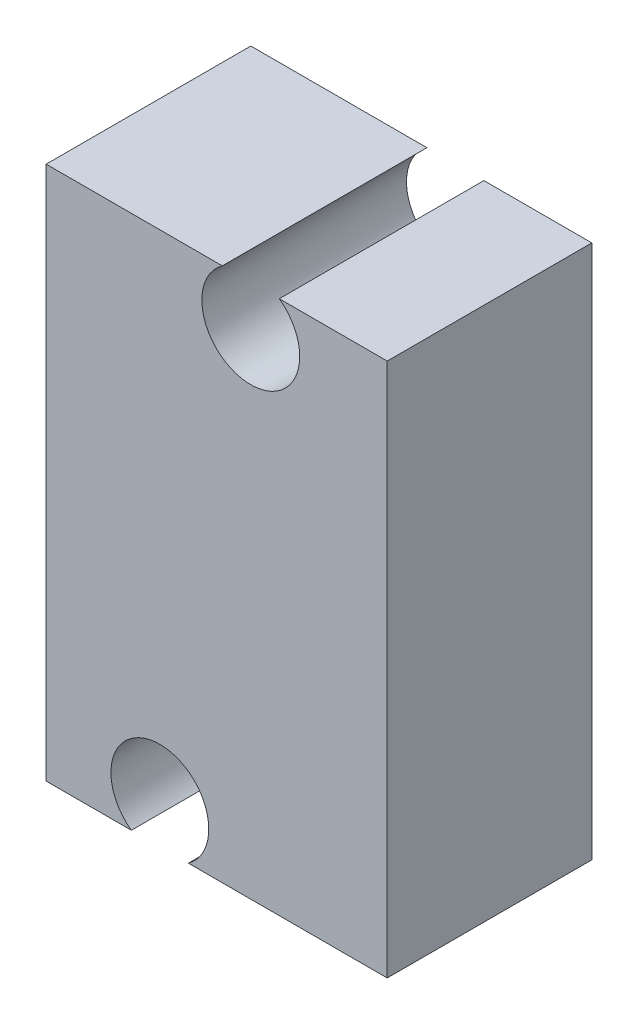
ISO-10303-21;
HEADER;
FILE_DESCRIPTION(('STEP AP214'),'2;1');
FILE_NAME('part.step','',(''),(''),'','','');
FILE_SCHEMA(('AUTOMOTIVE_DESIGN { 1 0 10303 214 1 1 1 1 }'));
ENDSEC;
DATA;
#1=APPLICATION_CONTEXT('core data for automotive mechanical design processes');
#2=APPLICATION_PROTOCOL_DEFINITION('international standard','automotive_design',2000,#1);
#3=PRODUCT_CONTEXT('',#1,'mechanical');
#4=PRODUCT('Part','Part','',(#3));
#5=PRODUCT_RELATED_PRODUCT_CATEGORY('part','',(#4));
#6=PRODUCT_DEFINITION_FORMATION('','',#4);
#7=PRODUCT_DEFINITION_CONTEXT('part definition',#1,'design');
#8=PRODUCT_DEFINITION('design','',#6,#7);
#9=PRODUCT_DEFINITION_SHAPE('','',#8);
#10=(LENGTH_UNIT() NAMED_UNIT(*) SI_UNIT(.MILLI.,.METRE.));
#11=(NAMED_UNIT(*) PLANE_ANGLE_UNIT() SI_UNIT($,.RADIAN.));
#12=(NAMED_UNIT(*) SI_UNIT($,.STERADIAN.) SOLID_ANGLE_UNIT());
#13=UNCERTAINTY_MEASURE_WITH_UNIT(LENGTH_MEASURE(1.E-05),#10,'distance_accuracy_value','');
#14=(GEOMETRIC_REPRESENTATION_CONTEXT(3) GLOBAL_UNCERTAINTY_ASSIGNED_CONTEXT((#13)) GLOBAL_UNIT_ASSIGNED_CONTEXT((#10,
#11,#12)) REPRESENTATION_CONTEXT('',''));
#15=CARTESIAN_POINT('',(0.,0.,0.));
#16=DIRECTION('',(0.,0.,1.));
#17=DIRECTION('',(1.,0.,0.));
#18=AXIS2_PLACEMENT_3D('',#15,#16,#17);
#19=CARTESIAN_POINT('',(-9.1179487179487,-19.0174358974359,11.43));
#20=DIRECTION('',(0.,1.,0.));
#21=DIRECTION('',(0.,0.,1.));
#22=AXIS2_PLACEMENT_3D('',#19,#20,#21);
#23=PLANE('',#22);
#24=DIRECTION('',(1.,0.,0.));
#25=VECTOR('',#24,1.);
#26=CARTESIAN_POINT('',(-9.1179487179487,-19.0174358974359,0.));
#27=LINE('',#26,#25);
#28=CARTESIAN_POINT('',(-9.1179487179487,-19.0174358974359,0.));
#29=VERTEX_POINT('',#28);
#30=CARTESIAN_POINT('',(-4.3589586781313,-19.0174358974359,0.));
#31=VERTEX_POINT('',#30);
#32=EDGE_CURVE('E126',#29,#31,#27,.T.);
#33=ORIENTED_EDGE('',*,*,#32,.T.);
#34=DIRECTION('',(0.,0.,1.));
#35=VECTOR('',#34,1.);
#36=CARTESIAN_POINT('',(-4.3589586781313,-19.0174358974359,0.));
#37=LINE('',#36,#35);
#38=CARTESIAN_POINT('',(-4.3589586781313,-19.0174358974359,11.43));
#39=VERTEX_POINT('',#38);
#40=EDGE_CURVE('E55',#31,#39,#37,.T.);
#41=ORIENTED_EDGE('',*,*,#40,.T.);
#42=DIRECTION('',(1.,0.,0.));
#43=VECTOR('',#42,1.);
#44=CARTESIAN_POINT('',(-9.1179487179487,-19.0174358974359,11.43));
#45=LINE('',#44,#43);
#46=CARTESIAN_POINT('',(-9.1179487179487,-19.0174358974359,11.43));
#47=VERTEX_POINT('',#46);
#48=EDGE_CURVE('E160',#47,#39,#45,.T.);
#49=ORIENTED_EDGE('',*,*,#48,.F.);
#50=DIRECTION('',(0.,0.,-1.));
#51=VECTOR('',#50,1.);
#52=CARTESIAN_POINT('',(-9.1179487179487,-19.0174358974359,11.43));
#53=LINE('',#52,#51);
#54=EDGE_CURVE('E109',#47,#29,#53,.T.);
#55=ORIENTED_EDGE('',*,*,#54,.T.);
#56=EDGE_LOOP('',(#33,#41,#49,#55));
#57=FACE_BOUND('',#56,.T.);
#58=ADVANCED_FACE('F39',(#57),#23,.F.);
#59=CARTESIAN_POINT('',(-9.1179487179487,10.8275641025641,11.43));
#60=DIRECTION('',(0.,-1.,0.));
#61=DIRECTION('',(0.,0.,-1.));
#62=AXIS2_PLACEMENT_3D('',#59,#60,#61);
#63=PLANE('',#62);
#64=DIRECTION('',(-1.,0.,0.));
#65=VECTOR('',#64,1.);
#66=CARTESIAN_POINT('',(-9.1179487179487,10.8275641025641,0.));
#67=LINE('',#66,#65);
#68=CARTESIAN_POINT('',(9.9320512820513,10.8275641025641,0.));
#69=VERTEX_POINT('',#68);
#70=CARTESIAN_POINT('',(3.9030612422339,10.8275641025641,0.));
#71=VERTEX_POINT('',#70);
#72=EDGE_CURVE('E138',#69,#71,#67,.T.);
#73=ORIENTED_EDGE('',*,*,#72,.T.);
#74=DIRECTION('',(0.,0.,1.));
#75=VECTOR('',#74,1.);
#76=CARTESIAN_POINT('',(3.9030612422339,10.8275641025641,0.));
#77=LINE('',#76,#75);
#78=CARTESIAN_POINT('',(3.9030612422339,10.8275641025641,11.43));
#79=VERTEX_POINT('',#78);
#80=EDGE_CURVE('E63',#71,#79,#77,.T.);
#81=ORIENTED_EDGE('',*,*,#80,.T.);
#82=DIRECTION('',(-1.,0.,0.));
#83=VECTOR('',#82,1.);
#84=CARTESIAN_POINT('',(-9.1179487179487,10.8275641025641,11.43));
#85=LINE('',#84,#83);
#86=CARTESIAN_POINT('',(9.9320512820513,10.8275641025641,11.43));
#87=VERTEX_POINT('',#86);
#88=EDGE_CURVE('E148',#87,#79,#85,.T.);
#89=ORIENTED_EDGE('',*,*,#88,.F.);
#90=DIRECTION('',(0.,0.,-1.));
#91=VECTOR('',#90,1.);
#92=CARTESIAN_POINT('',(9.9320512820513,10.8275641025641,11.43));
#93=LINE('',#92,#91);
#94=EDGE_CURVE('E147',#87,#69,#93,.T.);
#95=ORIENTED_EDGE('',*,*,#94,.T.);
#96=EDGE_LOOP('',(#73,#81,#89,#95));
#97=FACE_BOUND('',#96,.T.);
#98=ADVANCED_FACE('F199',(#97),#63,.F.);
#99=CARTESIAN_POINT('',(-9.1179487179487,10.8275641025641,11.43));
#100=DIRECTION('',(1.,0.,0.));
#101=DIRECTION('',(0.,1.,0.));
#102=AXIS2_PLACEMENT_3D('',#99,#100,#101);
#103=PLANE('',#102);
#104=DIRECTION('',(0.,-1.,0.));
#105=VECTOR('',#104,1.);
#106=CARTESIAN_POINT('',(-9.1179487179487,10.8275641025641,0.));
#107=LINE('',#106,#105);
#108=CARTESIAN_POINT('',(-9.1179487179487,10.8275641025641,0.));
#109=VERTEX_POINT('',#108);
#110=EDGE_CURVE('E127',#109,#29,#107,.T.);
#111=ORIENTED_EDGE('',*,*,#110,.T.);
#112=ORIENTED_EDGE('',*,*,#54,.F.);
#113=DIRECTION('',(0.,-1.,0.));
#114=VECTOR('',#113,1.);
#115=CARTESIAN_POINT('',(-9.1179487179487,10.8275641025641,11.43));
#116=LINE('',#115,#114);
#117=CARTESIAN_POINT('',(-9.1179487179487,10.8275641025641,11.43));
#118=VERTEX_POINT('',#117);
#119=EDGE_CURVE('E142',#118,#47,#116,.T.);
#120=ORIENTED_EDGE('',*,*,#119,.F.);
#121=DIRECTION('',(0.,0.,-1.));
#122=VECTOR('',#121,1.);
#123=CARTESIAN_POINT('',(-9.1179487179487,10.8275641025641,11.43));
#124=LINE('',#123,#122);
#125=EDGE_CURVE('E143',#118,#109,#124,.T.);
#126=ORIENTED_EDGE('',*,*,#125,.T.);
#127=EDGE_LOOP('',(#111,#112,#120,#126));
#128=FACE_BOUND('',#127,.T.);
#129=ADVANCED_FACE('F41',(#128),#103,.F.);
#130=CARTESIAN_POINT('',(-1.1769387577661,-19.0174358974359,11.43));
#131=VERTEX_POINT('',#130);
#132=CARTESIAN_POINT('',(9.9320512820513,-19.0174358974359,11.43));
#133=VERTEX_POINT('',#132);
#134=EDGE_CURVE('E116',#131,#133,#45,.T.);
#135=ORIENTED_EDGE('',*,*,#134,.F.);
#136=DIRECTION('',(0.,0.,1.));
#137=VECTOR('',#136,1.);
#138=CARTESIAN_POINT('',(-1.1769387577661,-19.0174358974359,0.));
#139=LINE('',#138,#137);
#140=CARTESIAN_POINT('',(-1.1769387577661,-19.0174358974359,0.));
#141=VERTEX_POINT('',#140);
#142=EDGE_CURVE('E103',#131,#141,#139,.F.);
#143=ORIENTED_EDGE('',*,*,#142,.T.);
#144=CARTESIAN_POINT('',(9.9320512820513,-19.0174358974359,0.));
#145=VERTEX_POINT('',#144);
#146=EDGE_CURVE('E114',#141,#145,#27,.T.);
#147=ORIENTED_EDGE('',*,*,#146,.T.);
#148=DIRECTION('',(0.,0.,-1.));
#149=VECTOR('',#148,1.);
#150=CARTESIAN_POINT('',(9.9320512820513,-19.0174358974359,11.43));
#151=LINE('',#150,#149);
#152=EDGE_CURVE('E152',#133,#145,#151,.T.);
#153=ORIENTED_EDGE('',*,*,#152,.F.);
#154=EDGE_LOOP('',(#135,#143,#147,#153));
#155=FACE_BOUND('',#154,.T.);
#156=ADVANCED_FACE('F112',(#155),#23,.F.);
#157=CARTESIAN_POINT('',(9.9320512820513,10.8275641025641,11.43));
#158=DIRECTION('',(-1.,0.,0.));
#159=DIRECTION('',(0.,-1.,0.));
#160=AXIS2_PLACEMENT_3D('',#157,#158,#159);
#161=PLANE('',#160);
#162=DIRECTION('',(0.,1.,0.));
#163=VECTOR('',#162,1.);
#164=CARTESIAN_POINT('',(9.9320512820513,10.8275641025641,0.));
#165=LINE('',#164,#163);
#166=EDGE_CURVE('E124',#145,#69,#165,.T.);
#167=ORIENTED_EDGE('',*,*,#166,.T.);
#168=ORIENTED_EDGE('',*,*,#94,.F.);
#169=DIRECTION('',(0.,1.,0.));
#170=VECTOR('',#169,1.);
#171=CARTESIAN_POINT('',(9.9320512820513,10.8275641025641,11.43));
#172=LINE('',#171,#170);
#173=EDGE_CURVE('E175',#133,#87,#172,.T.);
#174=ORIENTED_EDGE('',*,*,#173,.F.);
#175=ORIENTED_EDGE('',*,*,#152,.T.);
#176=EDGE_LOOP('',(#167,#168,#174,#175));
#177=FACE_BOUND('',#176,.T.);
#178=ADVANCED_FACE('F203',(#177),#161,.F.);
#179=CARTESIAN_POINT('',(0.7210413218687,10.8275641025641,11.43));
#180=VERTEX_POINT('',#179);
#181=EDGE_CURVE('E177',#180,#118,#85,.T.);
#182=ORIENTED_EDGE('',*,*,#181,.F.);
#183=DIRECTION('',(0.,0.,1.));
#184=VECTOR('',#183,1.);
#185=CARTESIAN_POINT('',(0.7210413218687,10.8275641025641,0.));
#186=LINE('',#185,#184);
#187=CARTESIAN_POINT('',(0.7210413218687,10.8275641025641,0.));
#188=VERTEX_POINT('',#187);
#189=EDGE_CURVE('E187',#180,#188,#186,.F.);
#190=ORIENTED_EDGE('',*,*,#189,.T.);
#191=EDGE_CURVE('E137',#188,#109,#67,.T.);
#192=ORIENTED_EDGE('',*,*,#191,.T.);
#193=ORIENTED_EDGE('',*,*,#125,.F.);
#194=EDGE_LOOP('',(#182,#190,#192,#193));
#195=FACE_BOUND('',#194,.T.);
#196=ADVANCED_FACE('F205',(#195),#63,.F.);
#197=CARTESIAN_POINT('',(0.,0.,11.43));
#198=DIRECTION('',(0.,0.,1.));
#199=DIRECTION('',(1.,0.,0.));
#200=AXIS2_PLACEMENT_3D('',#197,#198,#199);
#201=PLANE('',#200);
#202=CARTESIAN_POINT('',(2.3120512820513,8.60506410256409,11.43));
#203=DIRECTION('',(0.,0.,1.));
#204=DIRECTION('',(1.,0.,0.));
#205=AXIS2_PLACEMENT_3D('',#202,#203,#204);
#206=CIRCLE('',#205,2.73327988749785);
#207=EDGE_CURVE('E118',#180,#79,#206,.T.);
#208=ORIENTED_EDGE('',*,*,#207,.F.);
#209=ORIENTED_EDGE('',*,*,#181,.T.);
#210=ORIENTED_EDGE('',*,*,#119,.T.);
#211=ORIENTED_EDGE('',*,*,#48,.T.);
#212=CARTESIAN_POINT('',(-2.7679487179487,-16.7949358974359,11.43));
#213=DIRECTION('',(0.,0.,1.));
#214=DIRECTION('',(1.,0.,0.));
#215=AXIS2_PLACEMENT_3D('',#212,#213,#214);
#216=CIRCLE('',#215,2.73327988749785);
#217=EDGE_CURVE('E192',#131,#39,#216,.T.);
#218=ORIENTED_EDGE('',*,*,#217,.F.);
#219=ORIENTED_EDGE('',*,*,#134,.T.);
#220=ORIENTED_EDGE('',*,*,#173,.T.);
#221=ORIENTED_EDGE('',*,*,#88,.T.);
#222=EDGE_LOOP('',(#208,#209,#210,#211,#218,#219,#220,#221));
#223=FACE_BOUND('',#222,.T.);
#224=ADVANCED_FACE('F204',(#223),#201,.T.);
#225=CARTESIAN_POINT('',(0.,0.,0.));
#226=DIRECTION('',(0.,0.,1.));
#227=DIRECTION('',(1.,0.,0.));
#228=AXIS2_PLACEMENT_3D('',#225,#226,#227);
#229=PLANE('',#228);
#230=ORIENTED_EDGE('',*,*,#191,.F.);
#231=CARTESIAN_POINT('',(2.3120512820513,8.60506410256409,0.));
#232=DIRECTION('',(0.,0.,1.));
#233=DIRECTION('',(1.,0.,0.));
#234=AXIS2_PLACEMENT_3D('',#231,#232,#233);
#235=CIRCLE('',#234,2.73327988749785);
#236=EDGE_CURVE('E11',#188,#71,#235,.T.);
#237=ORIENTED_EDGE('',*,*,#236,.T.);
#238=ORIENTED_EDGE('',*,*,#72,.F.);
#239=ORIENTED_EDGE('',*,*,#166,.F.);
#240=ORIENTED_EDGE('',*,*,#146,.F.);
#241=CARTESIAN_POINT('',(-2.7679487179487,-16.7949358974359,0.));
#242=DIRECTION('',(0.,0.,1.));
#243=DIRECTION('',(1.,0.,0.));
#244=AXIS2_PLACEMENT_3D('',#241,#242,#243);
#245=CIRCLE('',#244,2.73327988749785);
#246=EDGE_CURVE('E48',#141,#31,#245,.T.);
#247=ORIENTED_EDGE('',*,*,#246,.T.);
#248=ORIENTED_EDGE('',*,*,#32,.F.);
#249=ORIENTED_EDGE('',*,*,#110,.F.);
#250=EDGE_LOOP('',(#230,#237,#238,#239,#240,#247,#248,#249));
#251=FACE_BOUND('',#250,.T.);
#252=ADVANCED_FACE('F122',(#251),#229,.F.);
#253=CARTESIAN_POINT('',(-2.7679487179487,-16.7949358974359,0.));
#254=DIRECTION('',(0.,0.,1.));
#255=DIRECTION('',(1.,0.,0.));
#256=AXIS2_PLACEMENT_3D('',#253,#254,#255);
#257=CYLINDRICAL_SURFACE('',#256,2.73327988749785);
#258=ORIENTED_EDGE('',*,*,#246,.F.);
#259=ORIENTED_EDGE('',*,*,#142,.F.);
#260=ORIENTED_EDGE('',*,*,#217,.T.);
#261=ORIENTED_EDGE('',*,*,#40,.F.);
#262=EDGE_LOOP('',(#258,#259,#260,#261));
#263=FACE_BOUND('',#262,.T.);
#264=ADVANCED_FACE('F102',(#263),#257,.F.);
#265=CARTESIAN_POINT('',(2.3120512820513,8.60506410256409,0.));
#266=DIRECTION('',(0.,0.,1.));
#267=DIRECTION('',(1.,0.,0.));
#268=AXIS2_PLACEMENT_3D('',#265,#266,#267);
#269=CYLINDRICAL_SURFACE('',#268,2.73327988749785);
#270=ORIENTED_EDGE('',*,*,#236,.F.);
#271=ORIENTED_EDGE('',*,*,#189,.F.);
#272=ORIENTED_EDGE('',*,*,#207,.T.);
#273=ORIENTED_EDGE('',*,*,#80,.F.);
#274=EDGE_LOOP('',(#270,#271,#272,#273));
#275=FACE_BOUND('',#274,.T.);
#276=ADVANCED_FACE('F196',(#275),#269,.F.);
#277=CLOSED_SHELL('',(#58,#98,#129,#156,#178,#196,#224,#252,#264,#276));
#278=MANIFOLD_SOLID_BREP('B2',#277);
#279=ADVANCED_BREP_SHAPE_REPRESENTATION('',(#18,#278),#14);
#280=SHAPE_DEFINITION_REPRESENTATION(#9,#279);
ENDSEC;
END-ISO-10303-21;
